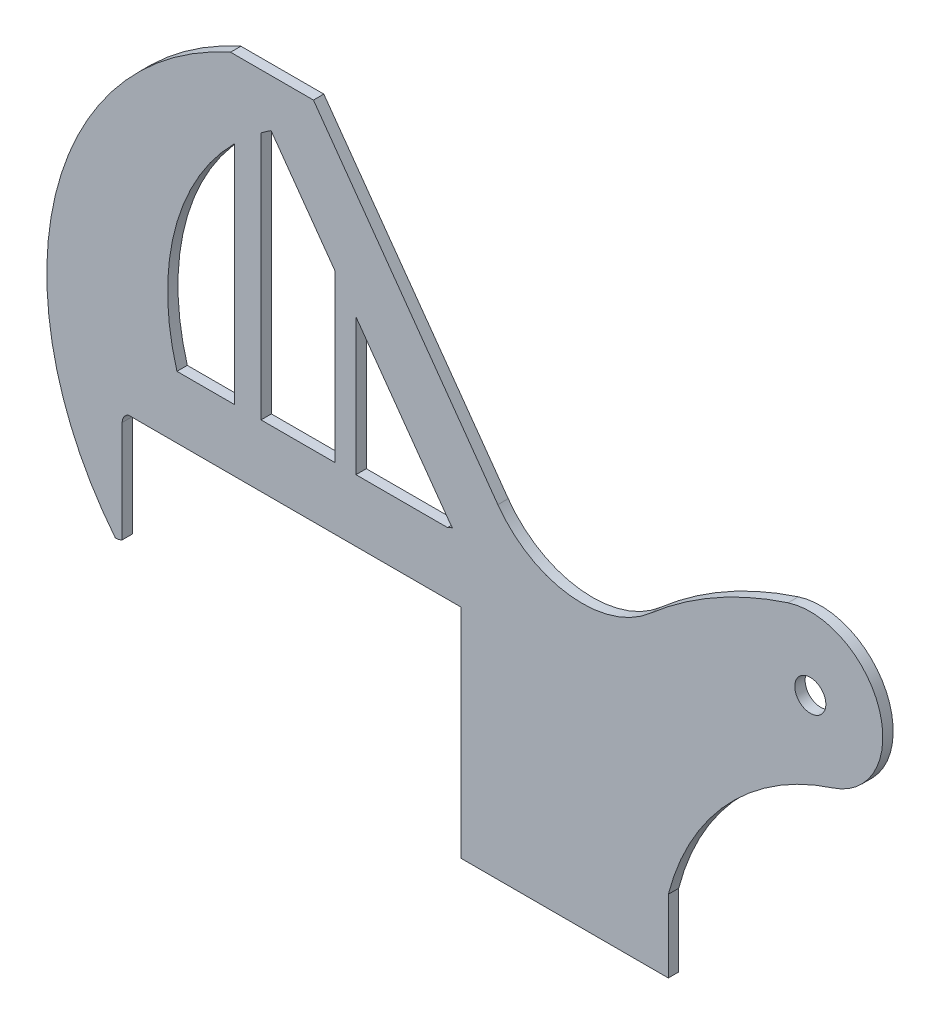
ISO-10303-21;
HEADER;
FILE_DESCRIPTION(('STEP AP214'),'2;1');
FILE_NAME('part.step','',(''),(''),'','','');
FILE_SCHEMA(('AUTOMOTIVE_DESIGN { 1 0 10303 214 1 1 1 1 }'));
ENDSEC;
DATA;
#1=APPLICATION_CONTEXT('core data for automotive mechanical design processes');
#2=APPLICATION_PROTOCOL_DEFINITION('international standard','automotive_design',2000,#1);
#3=PRODUCT_CONTEXT('',#1,'mechanical');
#4=PRODUCT('Part','Part','',(#3));
#5=PRODUCT_RELATED_PRODUCT_CATEGORY('part','',(#4));
#6=PRODUCT_DEFINITION_FORMATION('','',#4);
#7=PRODUCT_DEFINITION_CONTEXT('part definition',#1,'design');
#8=PRODUCT_DEFINITION('design','',#6,#7);
#9=PRODUCT_DEFINITION_SHAPE('','',#8);
#10=(LENGTH_UNIT() NAMED_UNIT(*) SI_UNIT(.MILLI.,.METRE.));
#11=(NAMED_UNIT(*) PLANE_ANGLE_UNIT() SI_UNIT($,.RADIAN.));
#12=(NAMED_UNIT(*) SI_UNIT($,.STERADIAN.) SOLID_ANGLE_UNIT());
#13=UNCERTAINTY_MEASURE_WITH_UNIT(LENGTH_MEASURE(1.E-05),#10,'distance_accuracy_value','');
#14=(GEOMETRIC_REPRESENTATION_CONTEXT(3) GLOBAL_UNCERTAINTY_ASSIGNED_CONTEXT((#13)) GLOBAL_UNIT_ASSIGNED_CONTEXT((#10,
#11,#12)) REPRESENTATION_CONTEXT('',''));
#15=CARTESIAN_POINT('',(0.,0.,0.));
#16=DIRECTION('',(0.,0.,1.));
#17=DIRECTION('',(1.,0.,0.));
#18=AXIS2_PLACEMENT_3D('',#15,#16,#17);
#19=CARTESIAN_POINT('',(-46.5012475591657,-2.898315985604,-5.));
#20=DIRECTION('',(0.,0.,-1.));
#21=DIRECTION('',(-1.,0.,0.));
#22=AXIS2_PLACEMENT_3D('',#19,#20,#21);
#23=PLANE('',#22);
#24=CARTESIAN_POINT('',(153.703952572074,-16.6665331952951,-5.));
#25=DIRECTION('',(0.,0.,-1.));
#26=DIRECTION('',(-1.,0.,0.));
#27=AXIS2_PLACEMENT_3D('',#24,#25,#26);
#28=CIRCLE('',#27,7.50000000000001);
#29=CARTESIAN_POINT('',(146.203952572074,-16.6665331952951,-5.));
#30=VERTEX_POINT('',#29);
#31=EDGE_CURVE('E278',#30,#30,#28,.T.);
#32=ORIENTED_EDGE('',*,*,#31,.F.);
#33=EDGE_LOOP('',(#32));
#34=FACE_BOUND('',#33,.T.);
#35=DIRECTION('',(0.,-1.,0.));
#36=VECTOR('',#35,1.);
#37=CARTESIAN_POINT('',(-124.250121532529,-2.89831598560399,-5.));
#38=LINE('',#37,#36);
#39=CARTESIAN_POINT('',(-124.250121532529,74.9162880156631,-5.));
#40=VERTEX_POINT('',#39);
#41=CARTESIAN_POINT('',(-124.250121532529,-34.0837119843369,-5.));
#42=VERTEX_POINT('',#41);
#43=EDGE_CURVE('E347',#40,#42,#38,.T.);
#44=ORIENTED_EDGE('',*,*,#43,.F.);
#45=CARTESIAN_POINT('',(-46.5012475591657,-2.898315985604,-5.));
#46=DIRECTION('',(0.,0.,-1.));
#47=DIRECTION('',(-1.,0.,0.));
#48=AXIS2_PLACEMENT_3D('',#45,#46,#47);
#49=CIRCLE('',#48,110.);
#50=CARTESIAN_POINT('',(-151.988076482981,-34.0837119843369,-5.));
#51=VERTEX_POINT('',#50);
#52=EDGE_CURVE('E356',#51,#40,#49,.T.);
#53=ORIENTED_EDGE('',*,*,#52,.F.);
#54=DIRECTION('',(-1.,0.,0.));
#55=VECTOR('',#54,1.);
#56=CARTESIAN_POINT('',(-46.5012475591657,-34.0837119843369,-5.));
#57=LINE('',#56,#55);
#58=EDGE_CURVE('E351',#42,#51,#57,.T.);
#59=ORIENTED_EDGE('',*,*,#58,.F.);
#60=EDGE_LOOP('',(#44,#53,#59));
#61=FACE_BOUND('',#60,.T.);
#62=DIRECTION('',(0.581238193719097,-0.813733471206735,0.));
#63=VECTOR('',#62,1.);
#64=CARTESIAN_POINT('',(-42.6803893935301,-0.169131581578513,-5.));
#65=LINE('',#64,#63);
#66=CARTESIAN_POINT('',(-106.558315082509,89.2599643829915,-5.));
#67=VERTEX_POINT('',#66);
#68=CARTESIAN_POINT('',(-75.5985462487027,45.9162880156631,-5.));
#69=VERTEX_POINT('',#68);
#70=EDGE_CURVE('E360',#67,#69,#65,.T.);
#71=ORIENTED_EDGE('',*,*,#70,.F.);
#72=CARTESIAN_POINT('',(-46.5012475591657,-2.898315985604,-5.));
#73=DIRECTION('',(0.,0.,-1.));
#74=DIRECTION('',(-1.,0.,0.));
#75=AXIS2_PLACEMENT_3D('',#72,#73,#74);
#76=CIRCLE('',#75,110.);
#77=CARTESIAN_POINT('',(-111.400909469673,85.9162880156631,-5.));
#78=VERTEX_POINT('',#77);
#79=EDGE_CURVE('E378',#78,#67,#76,.T.);
#80=ORIENTED_EDGE('',*,*,#79,.F.);
#81=DIRECTION('',(0.,1.,0.));
#82=VECTOR('',#81,1.);
#83=CARTESIAN_POINT('',(-111.400909469673,-2.898315985604,-5.));
#84=LINE('',#83,#82);
#85=CARTESIAN_POINT('',(-111.400909469673,-34.0837119843369,-5.));
#86=VERTEX_POINT('',#85);
#87=EDGE_CURVE('E373',#86,#78,#84,.T.);
#88=ORIENTED_EDGE('',*,*,#87,.F.);
#89=DIRECTION('',(-1.,0.,0.));
#90=VECTOR('',#89,1.);
#91=CARTESIAN_POINT('',(-46.5012475591657,-34.0837119843369,-5.));
#92=LINE('',#91,#90);
#93=CARTESIAN_POINT('',(-75.5985462487027,-34.0837119843369,-5.));
#94=VERTEX_POINT('',#93);
#95=EDGE_CURVE('E369',#94,#86,#92,.T.);
#96=ORIENTED_EDGE('',*,*,#95,.F.);
#97=DIRECTION('',(0.,1.,0.));
#98=VECTOR('',#97,1.);
#99=CARTESIAN_POINT('',(-75.5985462487027,-2.89831598560401,-5.));
#100=LINE('',#99,#98);
#101=EDGE_CURVE('E364',#94,#69,#100,.T.);
#102=ORIENTED_EDGE('',*,*,#101,.T.);
#103=EDGE_LOOP('',(#71,#80,#88,#96,#102));
#104=FACE_BOUND('',#103,.T.);
#105=DIRECTION('',(-0.908760762333003,-0.417317477280715,0.));
#106=VECTOR('',#105,1.);
#107=CARTESIAN_POINT('',(-30.2998668742654,-38.178839480558,-5.));
#108=LINE('',#107,#106);
#109=CARTESIAN_POINT('',(-19.0840716221747,-33.0283669092253,-5.));
#110=VERTEX_POINT('',#109);
#111=CARTESIAN_POINT('',(-21.3822169124991,-34.0837119843369,-5.));
#112=VERTEX_POINT('',#111);
#113=EDGE_CURVE('E385',#110,#112,#108,.T.);
#114=ORIENTED_EDGE('',*,*,#113,.F.);
#115=CARTESIAN_POINT('',(43.583392810866,16.6987776049491,-5.));
#116=DIRECTION('',(0.,0.,-1.));
#117=DIRECTION('',(-1.,0.,0.));
#118=AXIS2_PLACEMENT_3D('',#115,#116,#117);
#119=CIRCLE('',#118,80.);
#120=CARTESIAN_POINT('',(-21.5152848856728,-29.8002778925786,-5.));
#121=VERTEX_POINT('',#120);
#122=EDGE_CURVE('E367',#110,#121,#119,.T.);
#123=ORIENTED_EDGE('',*,*,#122,.T.);
#124=DIRECTION('',(0.581238193719097,-0.813733471206735,0.));
#125=VECTOR('',#124,1.);
#126=CARTESIAN_POINT('',(-42.6803893935301,-0.169131581578513,-5.));
#127=LINE('',#126,#125);
#128=CARTESIAN_POINT('',(-65.5985462487027,31.9162880156631,-5.));
#129=VERTEX_POINT('',#128);
#130=EDGE_CURVE('E395',#129,#121,#127,.T.);
#131=ORIENTED_EDGE('',*,*,#130,.F.);
#132=DIRECTION('',(0.,-1.,0.));
#133=VECTOR('',#132,1.);
#134=CARTESIAN_POINT('',(-65.5985462487027,-2.898315985604,-5.));
#135=LINE('',#134,#133);
#136=CARTESIAN_POINT('',(-65.5985462487027,-34.0837119843369,-5.));
#137=VERTEX_POINT('',#136);
#138=EDGE_CURVE('E384',#129,#137,#135,.T.);
#139=ORIENTED_EDGE('',*,*,#138,.T.);
#140=DIRECTION('',(-1.,0.,0.));
#141=VECTOR('',#140,1.);
#142=CARTESIAN_POINT('',(-46.5012475591657,-34.0837119843369,-5.));
#143=LINE('',#142,#141);
#144=EDGE_CURVE('E388',#112,#137,#143,.T.);
#145=ORIENTED_EDGE('',*,*,#144,.F.);
#146=EDGE_LOOP('',(#114,#123,#131,#139,#145));
#147=FACE_BOUND('',#146,.T.);
#148=DIRECTION('',(0.,-1.,0.));
#149=VECTOR('',#148,1.);
#150=CARTESIAN_POINT('',(-178.423236570133,0.,-5.));
#151=LINE('',#150,#149);
#152=CARTESIAN_POINT('',(-178.423236570133,-68.6662876792927,-5.));
#153=VERTEX_POINT('',#152);
#154=CARTESIAN_POINT('',(-178.423236570133,-117.76733605745,-5.));
#155=VERTEX_POINT('',#154);
#156=EDGE_CURVE('E290',#153,#155,#151,.T.);
#157=ORIENTED_EDGE('',*,*,#156,.T.);
#158=CARTESIAN_POINT('',(-181.423236570133,-112.571183634743,-5.));
#159=DIRECTION('',(0.,0.,1.));
#160=DIRECTION('',(1.,0.,0.));
#161=AXIS2_PLACEMENT_3D('',#158,#159,#160);
#162=CIRCLE('',#161,5.99999999999999);
#163=CARTESIAN_POINT('',(-181.759434047816,-118.561757167886,-5.));
#164=VERTEX_POINT('',#163);
#165=EDGE_CURVE('E73',#164,#155,#162,.T.);
#166=ORIENTED_EDGE('',*,*,#165,.F.);
#167=CARTESIAN_POINT('',(-64.8050101889918,-24.6380501506983,-5.));
#168=DIRECTION('',(0.,0.,1.));
#169=DIRECTION('',(1.,0.,0.));
#170=AXIS2_PLACEMENT_3D('',#167,#168,#169);
#171=CIRCLE('',#170,150.);
#172=CARTESIAN_POINT('',(-126.118657217934,112.258394974843,-5.));
#173=VERTEX_POINT('',#172);
#174=EDGE_CURVE('E295',#173,#164,#171,.T.);
#175=ORIENTED_EDGE('',*,*,#174,.F.);
#176=DIRECTION('',(-1.,0.,0.));
#177=VECTOR('',#176,1.);
#178=CARTESIAN_POINT('',(-46.5012475591657,112.258394974843,-5.));
#179=LINE('',#178,#177);
#180=CARTESIAN_POINT('',(-86.118657217934,112.258394974843,-5.));
#181=VERTEX_POINT('',#180);
#182=EDGE_CURVE('E441',#181,#173,#179,.T.);
#183=ORIENTED_EDGE('',*,*,#182,.F.);
#184=DIRECTION('',(-0.581238193719097,0.813733471206735,0.));
#185=VECTOR('',#184,1.);
#186=CARTESIAN_POINT('',(-97.1032807494708,127.636867918994,-5.));
#187=LINE('',#186,#185);
#188=CARTESIAN_POINT('',(2.89671925052924,-12.3631320810057,-5.));
#189=VERTEX_POINT('',#188);
#190=EDGE_CURVE('E334',#189,#181,#187,.T.);
#191=ORIENTED_EDGE('',*,*,#190,.F.);
#192=CARTESIAN_POINT('',(43.583392810866,16.6987776049491,-5.));
#193=DIRECTION('',(0.,0.,-1.));
#194=DIRECTION('',(1.,0.,0.));
#195=AXIS2_PLACEMENT_3D('',#192,#193,#194);
#196=CIRCLE('',#195,50.);
#197=CARTESIAN_POINT('',(76.4505432255038,-20.9807980776614,-5.));
#198=VERTEX_POINT('',#197);
#199=EDGE_CURVE('E312',#198,#189,#196,.T.);
#200=ORIENTED_EDGE('',*,*,#199,.F.);
#201=CARTESIAN_POINT('',(201.345714801128,-164.163185671581,-5.));
#202=DIRECTION('',(0.,0.,1.));
#203=DIRECTION('',(-1.,0.,0.));
#204=AXIS2_PLACEMENT_3D('',#201,#202,#203);
#205=CIRCLE('',#204,190.);
#206=CARTESIAN_POINT('',(142.946135294546,16.6391625251566,-5.));
#207=VERTEX_POINT('',#206);
#208=EDGE_CURVE('E309',#207,#198,#205,.T.);
#209=ORIENTED_EDGE('',*,*,#208,.F.);
#210=CARTESIAN_POINT('',(153.703952572074,-16.6665331952951,-5.));
#211=DIRECTION('',(0.,0.,1.));
#212=DIRECTION('',(1.,0.,0.));
#213=AXIS2_PLACEMENT_3D('',#210,#211,#212);
#214=CIRCLE('',#213,35.);
#215=CARTESIAN_POINT('',(164.461769849602,-49.9722289157468,-5.));
#216=VERTEX_POINT('',#215);
#217=EDGE_CURVE('E306',#216,#207,#214,.T.);
#218=ORIENTED_EDGE('',*,*,#217,.F.);
#219=CARTESIAN_POINT('',(201.345714801128,-164.163185671581,-5.));
#220=DIRECTION('',(0.,0.,-1.));
#221=DIRECTION('',(-1.,0.,0.));
#222=AXIS2_PLACEMENT_3D('',#219,#220,#221);
#223=CIRCLE('',#222,120.);
#224=CARTESIAN_POINT('',(85.1767634298667,-134.083711984337,-5.));
#225=VERTEX_POINT('',#224);
#226=EDGE_CURVE('E303',#225,#216,#223,.T.);
#227=ORIENTED_EDGE('',*,*,#226,.F.);
#228=DIRECTION('',(0.,1.,0.));
#229=VECTOR('',#228,1.);
#230=CARTESIAN_POINT('',(85.1767634298667,-134.083711984337,-5.));
#231=LINE('',#230,#229);
#232=CARTESIAN_POINT('',(85.1767634298667,-169.083711984337,-5.));
#233=VERTEX_POINT('',#232);
#234=EDGE_CURVE('E266',#233,#225,#231,.T.);
#235=ORIENTED_EDGE('',*,*,#234,.F.);
#236=DIRECTION('',(1.,0.,0.));
#237=VECTOR('',#236,1.);
#238=CARTESIAN_POINT('',(-14.8232365701333,-169.083711984337,-5.));
#239=LINE('',#238,#237);
#240=CARTESIAN_POINT('',(-14.8232365701333,-169.083711984337,-5.));
#241=VERTEX_POINT('',#240);
#242=EDGE_CURVE('E262',#241,#233,#239,.T.);
#243=ORIENTED_EDGE('',*,*,#242,.F.);
#244=DIRECTION('',(0.,-1.,0.));
#245=VECTOR('',#244,1.);
#246=CARTESIAN_POINT('',(-14.8232365701333,-64.0837119843369,-5.));
#247=LINE('',#246,#245);
#248=CARTESIAN_POINT('',(-14.8232365701333,-64.0837119843369,-5.));
#249=VERTEX_POINT('',#248);
#250=EDGE_CURVE('E245',#249,#241,#247,.T.);
#251=ORIENTED_EDGE('',*,*,#250,.F.);
#252=DIRECTION('',(1.,0.,0.));
#253=VECTOR('',#252,1.);
#254=CARTESIAN_POINT('',(-172.423236570133,-64.0837119843369,-5.));
#255=LINE('',#254,#253);
#256=CARTESIAN_POINT('',(-175.423236570133,-64.0837119843369,-5.));
#257=VERTEX_POINT('',#256);
#258=EDGE_CURVE('E256',#257,#249,#255,.T.);
#259=ORIENTED_EDGE('',*,*,#258,.F.);
#260=CARTESIAN_POINT('',(-173.423236570133,-68.6662876792927,-5.));
#261=DIRECTION('',(0.,0.,1.));
#262=DIRECTION('',(1.,0.,0.));
#263=AXIS2_PLACEMENT_3D('',#260,#261,#262);
#264=CIRCLE('',#263,5.);
#265=EDGE_CURVE('E368',#257,#153,#264,.T.);
#266=ORIENTED_EDGE('',*,*,#265,.T.);
#267=EDGE_LOOP('',(#157,#166,#175,#183,#191,#200,#209,#218,#227,#235,#243,#251,#259,#266));
#268=FACE_BOUND('',#267,.T.);
#269=ADVANCED_FACE('F57',(#34,#61,#104,#147,#268),#23,.T.);
#270=CARTESIAN_POINT('',(-46.5012475591657,-2.898315985604,0.));
#271=DIRECTION('',(0.,0.,-1.));
#272=DIRECTION('',(-1.,0.,0.));
#273=AXIS2_PLACEMENT_3D('',#270,#271,#272);
#274=PLANE('',#273);
#275=CARTESIAN_POINT('',(153.703952572074,-16.6665331952951,0.));
#276=DIRECTION('',(0.,0.,1.));
#277=DIRECTION('',(1.,0.,0.));
#278=AXIS2_PLACEMENT_3D('',#275,#276,#277);
#279=CIRCLE('',#278,7.50000000000001);
#280=CARTESIAN_POINT('',(161.203952572074,-16.6665331952951,0.));
#281=VERTEX_POINT('',#280);
#282=EDGE_CURVE('E859',#281,#281,#279,.T.);
#283=ORIENTED_EDGE('',*,*,#282,.F.);
#284=EDGE_LOOP('',(#283));
#285=FACE_BOUND('',#284,.T.);
#286=CARTESIAN_POINT('',(43.583392810866,16.6987776049491,0.));
#287=DIRECTION('',(0.,0.,1.));
#288=DIRECTION('',(1.,0.,0.));
#289=AXIS2_PLACEMENT_3D('',#286,#287,#288);
#290=CIRCLE('',#289,80.);
#291=CARTESIAN_POINT('',(-21.5152848856728,-29.8002778925786,0.));
#292=VERTEX_POINT('',#291);
#293=CARTESIAN_POINT('',(-19.0840716221747,-33.0283669092253,0.));
#294=VERTEX_POINT('',#293);
#295=EDGE_CURVE('E316',#292,#294,#290,.T.);
#296=ORIENTED_EDGE('',*,*,#295,.T.);
#297=DIRECTION('',(0.908760762333003,0.417317477280715,0.));
#298=VECTOR('',#297,1.);
#299=CARTESIAN_POINT('',(9.20217056731396,-20.038872070161,0.));
#300=LINE('',#299,#298);
#301=CARTESIAN_POINT('',(-21.3822169124991,-34.0837119843369,0.));
#302=VERTEX_POINT('',#301);
#303=EDGE_CURVE('E391',#302,#294,#300,.T.);
#304=ORIENTED_EDGE('',*,*,#303,.F.);
#305=DIRECTION('',(1.,0.,0.));
#306=VECTOR('',#305,1.);
#307=CARTESIAN_POINT('',(0.,-34.0837119843369,0.));
#308=LINE('',#307,#306);
#309=CARTESIAN_POINT('',(-65.5985462487027,-34.0837119843369,0.));
#310=VERTEX_POINT('',#309);
#311=EDGE_CURVE('E402',#310,#302,#308,.T.);
#312=ORIENTED_EDGE('',*,*,#311,.F.);
#313=DIRECTION('',(0.,1.,0.));
#314=VECTOR('',#313,1.);
#315=CARTESIAN_POINT('',(-65.5985462487027,0.,0.));
#316=LINE('',#315,#314);
#317=CARTESIAN_POINT('',(-65.5985462487027,31.9162880156631,0.));
#318=VERTEX_POINT('',#317);
#319=EDGE_CURVE('E337',#310,#318,#316,.T.);
#320=ORIENTED_EDGE('',*,*,#319,.T.);
#321=DIRECTION('',(-0.581238193719097,0.813733471206735,0.));
#322=VECTOR('',#321,1.);
#323=CARTESIAN_POINT('',(-28.3413335897057,-20.2438097069326,0.));
#324=LINE('',#323,#322);
#325=EDGE_CURVE('E363',#292,#318,#324,.T.);
#326=ORIENTED_EDGE('',*,*,#325,.F.);
#327=EDGE_LOOP('',(#296,#304,#312,#320,#326));
#328=FACE_BOUND('',#327,.T.);
#329=CARTESIAN_POINT('',(-46.5012475591657,-2.898315985604,0.));
#330=DIRECTION('',(0.,0.,1.));
#331=DIRECTION('',(1.,0.,0.));
#332=AXIS2_PLACEMENT_3D('',#329,#330,#331);
#333=CIRCLE('',#332,110.);
#334=CARTESIAN_POINT('',(-106.558315082509,89.2599643829914,0.));
#335=VERTEX_POINT('',#334);
#336=CARTESIAN_POINT('',(-111.400909469673,85.9162880156631,0.));
#337=VERTEX_POINT('',#336);
#338=EDGE_CURVE('E350',#335,#337,#333,.T.);
#339=ORIENTED_EDGE('',*,*,#338,.F.);
#340=DIRECTION('',(-0.581238193719097,0.813733471206735,0.));
#341=VECTOR('',#340,1.);
#342=CARTESIAN_POINT('',(-28.3413335897057,-20.2438097069326,0.));
#343=LINE('',#342,#341);
#344=CARTESIAN_POINT('',(-75.5985462487027,45.9162880156631,0.));
#345=VERTEX_POINT('',#344);
#346=EDGE_CURVE('E421',#345,#335,#343,.T.);
#347=ORIENTED_EDGE('',*,*,#346,.F.);
#348=DIRECTION('',(0.,-1.,0.));
#349=VECTOR('',#348,1.);
#350=CARTESIAN_POINT('',(-75.5985462487027,0.,0.));
#351=LINE('',#350,#349);
#352=CARTESIAN_POINT('',(-75.5985462487027,-34.0837119843369,0.));
#353=VERTEX_POINT('',#352);
#354=EDGE_CURVE('E394',#345,#353,#351,.T.);
#355=ORIENTED_EDGE('',*,*,#354,.T.);
#356=DIRECTION('',(1.,0.,0.));
#357=VECTOR('',#356,1.);
#358=CARTESIAN_POINT('',(0.,-34.0837119843369,0.));
#359=LINE('',#358,#357);
#360=CARTESIAN_POINT('',(-111.400909469673,-34.0837119843369,0.));
#361=VERTEX_POINT('',#360);
#362=EDGE_CURVE('E377',#361,#353,#359,.T.);
#363=ORIENTED_EDGE('',*,*,#362,.F.);
#364=DIRECTION('',(0.,-1.,0.));
#365=VECTOR('',#364,1.);
#366=CARTESIAN_POINT('',(-111.400909469673,0.,0.));
#367=LINE('',#366,#365);
#368=EDGE_CURVE('E381',#337,#361,#367,.T.);
#369=ORIENTED_EDGE('',*,*,#368,.F.);
#370=EDGE_LOOP('',(#339,#347,#355,#363,#369));
#371=FACE_BOUND('',#370,.T.);
#372=CARTESIAN_POINT('',(-46.5012475591657,-2.898315985604,0.));
#373=DIRECTION('',(0.,0.,1.));
#374=DIRECTION('',(1.,0.,0.));
#375=AXIS2_PLACEMENT_3D('',#372,#373,#374);
#376=CIRCLE('',#375,110.);
#377=CARTESIAN_POINT('',(-124.250121532529,74.9162880156631,0.));
#378=VERTEX_POINT('',#377);
#379=CARTESIAN_POINT('',(-151.988076482981,-34.0837119843369,0.));
#380=VERTEX_POINT('',#379);
#381=EDGE_CURVE('E434',#378,#380,#376,.T.);
#382=ORIENTED_EDGE('',*,*,#381,.F.);
#383=DIRECTION('',(0.,1.,0.));
#384=VECTOR('',#383,1.);
#385=CARTESIAN_POINT('',(-124.250121532529,0.,0.));
#386=LINE('',#385,#384);
#387=CARTESIAN_POINT('',(-124.250121532529,-34.0837119843369,0.));
#388=VERTEX_POINT('',#387);
#389=EDGE_CURVE('E355',#388,#378,#386,.T.);
#390=ORIENTED_EDGE('',*,*,#389,.F.);
#391=DIRECTION('',(1.,0.,0.));
#392=VECTOR('',#391,1.);
#393=CARTESIAN_POINT('',(0.,-34.0837119843369,0.));
#394=LINE('',#393,#392);
#395=EDGE_CURVE('E359',#380,#388,#394,.T.);
#396=ORIENTED_EDGE('',*,*,#395,.F.);
#397=EDGE_LOOP('',(#382,#390,#396));
#398=FACE_BOUND('',#397,.T.);
#399=CARTESIAN_POINT('',(-181.423236570133,-112.571183634743,0.));
#400=DIRECTION('',(0.,0.,1.));
#401=DIRECTION('',(1.,0.,0.));
#402=AXIS2_PLACEMENT_3D('',#399,#400,#401);
#403=CIRCLE('',#402,5.99999999999999);
#404=CARTESIAN_POINT('',(-181.759434047816,-118.561757167886,0.));
#405=VERTEX_POINT('',#404);
#406=CARTESIAN_POINT('',(-178.423236570133,-117.76733605745,0.));
#407=VERTEX_POINT('',#406);
#408=EDGE_CURVE('E282',#405,#407,#403,.T.);
#409=ORIENTED_EDGE('',*,*,#408,.T.);
#410=DIRECTION('',(0.,-1.,0.));
#411=VECTOR('',#410,1.);
#412=CARTESIAN_POINT('',(-178.423236570133,0.,0.));
#413=LINE('',#412,#411);
#414=CARTESIAN_POINT('',(-178.423236570133,-68.6662876792927,0.));
#415=VERTEX_POINT('',#414);
#416=EDGE_CURVE('E448',#415,#407,#413,.T.);
#417=ORIENTED_EDGE('',*,*,#416,.F.);
#418=CARTESIAN_POINT('',(-173.423236570133,-68.6662876792927,0.));
#419=DIRECTION('',(0.,0.,1.));
#420=DIRECTION('',(1.,0.,0.));
#421=AXIS2_PLACEMENT_3D('',#418,#419,#420);
#422=CIRCLE('',#421,5.);
#423=CARTESIAN_POINT('',(-175.423236570133,-64.0837119843369,0.));
#424=VERTEX_POINT('',#423);
#425=EDGE_CURVE('E65',#424,#415,#422,.T.);
#426=ORIENTED_EDGE('',*,*,#425,.F.);
#427=DIRECTION('',(1.,0.,0.));
#428=VECTOR('',#427,1.);
#429=CARTESIAN_POINT('',(-172.423236570133,-64.0837119843369,0.));
#430=LINE('',#429,#428);
#431=CARTESIAN_POINT('',(-14.8232365701333,-64.0837119843369,0.));
#432=VERTEX_POINT('',#431);
#433=EDGE_CURVE('E331',#424,#432,#430,.T.);
#434=ORIENTED_EDGE('',*,*,#433,.T.);
#435=DIRECTION('',(0.,-1.,0.));
#436=VECTOR('',#435,1.);
#437=CARTESIAN_POINT('',(-14.8232365701333,-64.0837119843369,0.));
#438=LINE('',#437,#436);
#439=CARTESIAN_POINT('',(-14.8232365701333,-169.083711984337,0.));
#440=VERTEX_POINT('',#439);
#441=EDGE_CURVE('E329',#432,#440,#438,.T.);
#442=ORIENTED_EDGE('',*,*,#441,.T.);
#443=DIRECTION('',(1.,0.,0.));
#444=VECTOR('',#443,1.);
#445=CARTESIAN_POINT('',(-14.8232365701333,-169.083711984337,0.));
#446=LINE('',#445,#444);
#447=CARTESIAN_POINT('',(85.1767634298667,-169.083711984337,0.));
#448=VERTEX_POINT('',#447);
#449=EDGE_CURVE('E264',#440,#448,#446,.T.);
#450=ORIENTED_EDGE('',*,*,#449,.T.);
#451=DIRECTION('',(0.,1.,0.));
#452=VECTOR('',#451,1.);
#453=CARTESIAN_POINT('',(85.1767634298667,-134.083711984337,0.));
#454=LINE('',#453,#452);
#455=CARTESIAN_POINT('',(85.1767634298667,-134.083711984337,0.));
#456=VERTEX_POINT('',#455);
#457=EDGE_CURVE('E272',#448,#456,#454,.T.);
#458=ORIENTED_EDGE('',*,*,#457,.T.);
#459=CARTESIAN_POINT('',(201.345714801128,-164.163185671581,0.));
#460=DIRECTION('',(0.,0.,-1.));
#461=DIRECTION('',(-1.,0.,0.));
#462=AXIS2_PLACEMENT_3D('',#459,#460,#461);
#463=CIRCLE('',#462,120.);
#464=CARTESIAN_POINT('',(164.461769849602,-49.9722289157468,0.));
#465=VERTEX_POINT('',#464);
#466=EDGE_CURVE('E326',#456,#465,#463,.T.);
#467=ORIENTED_EDGE('',*,*,#466,.T.);
#468=CARTESIAN_POINT('',(153.703952572074,-16.6665331952951,0.));
#469=DIRECTION('',(0.,0.,1.));
#470=DIRECTION('',(1.,0.,0.));
#471=AXIS2_PLACEMENT_3D('',#468,#469,#470);
#472=CIRCLE('',#471,35.);
#473=CARTESIAN_POINT('',(142.946135294546,16.6391625251566,0.));
#474=VERTEX_POINT('',#473);
#475=EDGE_CURVE('E323',#465,#474,#472,.T.);
#476=ORIENTED_EDGE('',*,*,#475,.T.);
#477=CARTESIAN_POINT('',(201.345714801128,-164.163185671581,0.));
#478=DIRECTION('',(0.,0.,1.));
#479=DIRECTION('',(-1.,0.,0.));
#480=AXIS2_PLACEMENT_3D('',#477,#478,#479);
#481=CIRCLE('',#480,190.);
#482=CARTESIAN_POINT('',(76.4505432255038,-20.9807980776614,0.));
#483=VERTEX_POINT('',#482);
#484=EDGE_CURVE('E320',#474,#483,#481,.T.);
#485=ORIENTED_EDGE('',*,*,#484,.T.);
#486=CARTESIAN_POINT('',(43.583392810866,16.6987776049491,0.));
#487=DIRECTION('',(0.,0.,-1.));
#488=DIRECTION('',(1.,0.,0.));
#489=AXIS2_PLACEMENT_3D('',#486,#487,#488);
#490=CIRCLE('',#489,50.);
#491=CARTESIAN_POINT('',(2.89671925052924,-12.3631320810057,0.));
#492=VERTEX_POINT('',#491);
#493=EDGE_CURVE('E317',#483,#492,#490,.T.);
#494=ORIENTED_EDGE('',*,*,#493,.T.);
#495=DIRECTION('',(-0.581238193719097,0.813733471206735,0.));
#496=VECTOR('',#495,1.);
#497=CARTESIAN_POINT('',(-97.1032807494708,127.636867918994,0.));
#498=LINE('',#497,#496);
#499=CARTESIAN_POINT('',(-86.118657217934,112.258394974843,0.));
#500=VERTEX_POINT('',#499);
#501=EDGE_CURVE('E313',#492,#500,#498,.T.);
#502=ORIENTED_EDGE('',*,*,#501,.T.);
#503=DIRECTION('',(1.,0.,0.));
#504=VECTOR('',#503,1.);
#505=CARTESIAN_POINT('',(0.,112.258394974843,0.));
#506=LINE('',#505,#504);
#507=CARTESIAN_POINT('',(-126.118657217934,112.258394974843,0.));
#508=VERTEX_POINT('',#507);
#509=EDGE_CURVE('E296',#508,#500,#506,.T.);
#510=ORIENTED_EDGE('',*,*,#509,.F.);
#511=CARTESIAN_POINT('',(-64.8050101889918,-24.6380501506983,0.));
#512=DIRECTION('',(0.,0.,1.));
#513=DIRECTION('',(1.,0.,0.));
#514=AXIS2_PLACEMENT_3D('',#511,#512,#513);
#515=CIRCLE('',#514,150.);
#516=EDGE_CURVE('E60',#508,#405,#515,.T.);
#517=ORIENTED_EDGE('',*,*,#516,.T.);
#518=EDGE_LOOP('',(#409,#417,#426,#434,#442,#450,#458,#467,#476,#485,#494,#502,#510,#517));
#519=FACE_BOUND('',#518,.T.);
#520=ADVANCED_FACE('F465',(#285,#328,#371,#398,#519),#274,.F.);
#521=CARTESIAN_POINT('',(-64.8050101889918,-24.6380501506983,-5.));
#522=DIRECTION('',(0.,0.,1.));
#523=DIRECTION('',(1.,0.,0.));
#524=AXIS2_PLACEMENT_3D('',#521,#522,#523);
#525=CYLINDRICAL_SURFACE('',#524,150.);
#526=ORIENTED_EDGE('',*,*,#174,.T.);
#527=DIRECTION('',(0.,0.,1.));
#528=VECTOR('',#527,1.);
#529=CARTESIAN_POINT('',(-181.759434047816,-118.561757167886,-5.));
#530=LINE('',#529,#528);
#531=EDGE_CURVE('E285',#164,#405,#530,.T.);
#532=ORIENTED_EDGE('',*,*,#531,.T.);
#533=ORIENTED_EDGE('',*,*,#516,.F.);
#534=DIRECTION('',(0.,0.,1.));
#535=VECTOR('',#534,1.);
#536=CARTESIAN_POINT('',(-126.118657217934,112.258394974843,-10.));
#537=LINE('',#536,#535);
#538=EDGE_CURVE('E100',#173,#508,#537,.T.);
#539=ORIENTED_EDGE('',*,*,#538,.F.);
#540=EDGE_LOOP('',(#526,#532,#533,#539));
#541=FACE_BOUND('',#540,.T.);
#542=ADVANCED_FACE('F453',(#541),#525,.T.);
#543=CARTESIAN_POINT('',(-178.423236570133,0.,-5.));
#544=DIRECTION('',(-1.,0.,0.));
#545=DIRECTION('',(0.,0.,1.));
#546=AXIS2_PLACEMENT_3D('',#543,#544,#545);
#547=PLANE('',#546);
#548=DIRECTION('',(0.,0.,1.));
#549=VECTOR('',#548,1.);
#550=CARTESIAN_POINT('',(-178.423236570133,-117.76733605745,-5.));
#551=LINE('',#550,#549);
#552=EDGE_CURVE('E288',#155,#407,#551,.T.);
#553=ORIENTED_EDGE('',*,*,#552,.F.);
#554=ORIENTED_EDGE('',*,*,#156,.F.);
#555=DIRECTION('',(0.,0.,1.));
#556=VECTOR('',#555,1.);
#557=CARTESIAN_POINT('',(-178.423236570133,-68.6662876792927,-5.));
#558=LINE('',#557,#556);
#559=EDGE_CURVE('E89',#153,#415,#558,.T.);
#560=ORIENTED_EDGE('',*,*,#559,.T.);
#561=ORIENTED_EDGE('',*,*,#416,.T.);
#562=EDGE_LOOP('',(#553,#554,#560,#561));
#563=FACE_BOUND('',#562,.T.);
#564=ADVANCED_FACE('F615',(#563),#547,.F.);
#565=CARTESIAN_POINT('',(-97.1032807494708,127.636867918994,-5.));
#566=DIRECTION('',(0.813733471206735,0.581238193719097,0.));
#567=DIRECTION('',(-0.581238193719097,0.813733471206735,0.));
#568=AXIS2_PLACEMENT_3D('',#565,#566,#567);
#569=PLANE('',#568);
#570=DIRECTION('',(0.,0.,-1.));
#571=VECTOR('',#570,1.);
#572=CARTESIAN_POINT('',(-86.118657217934,112.258394974843,-5.));
#573=LINE('',#572,#571);
#574=EDGE_CURVE('E293',#500,#181,#573,.T.);
#575=ORIENTED_EDGE('',*,*,#574,.F.);
#576=ORIENTED_EDGE('',*,*,#501,.F.);
#577=DIRECTION('',(0.,0.,1.));
#578=VECTOR('',#577,1.);
#579=CARTESIAN_POINT('',(2.89671925052924,-12.3631320810057,-5.));
#580=LINE('',#579,#578);
#581=EDGE_CURVE('E310',#189,#492,#580,.T.);
#582=ORIENTED_EDGE('',*,*,#581,.F.);
#583=ORIENTED_EDGE('',*,*,#190,.T.);
#584=EDGE_LOOP('',(#575,#576,#582,#583));
#585=FACE_BOUND('',#584,.T.);
#586=ADVANCED_FACE('F463',(#585),#569,.T.);
#587=CARTESIAN_POINT('',(43.583392810866,16.6987776049491,-5.));
#588=DIRECTION('',(0.,0.,1.));
#589=DIRECTION('',(1.,0.,0.));
#590=AXIS2_PLACEMENT_3D('',#587,#588,#589);
#591=CYLINDRICAL_SURFACE('',#590,50.);
#592=ORIENTED_EDGE('',*,*,#493,.F.);
#593=DIRECTION('',(0.,0.,1.));
#594=VECTOR('',#593,1.);
#595=CARTESIAN_POINT('',(76.4505432255038,-20.9807980776614,-5.));
#596=LINE('',#595,#594);
#597=EDGE_CURVE('E307',#198,#483,#596,.T.);
#598=ORIENTED_EDGE('',*,*,#597,.F.);
#599=ORIENTED_EDGE('',*,*,#199,.T.);
#600=ORIENTED_EDGE('',*,*,#581,.T.);
#601=EDGE_LOOP('',(#592,#598,#599,#600));
#602=FACE_BOUND('',#601,.T.);
#603=ADVANCED_FACE('F469',(#602),#591,.F.);
#604=CARTESIAN_POINT('',(201.345714801128,-164.163185671581,-5.));
#605=DIRECTION('',(0.,0.,1.));
#606=DIRECTION('',(1.,0.,0.));
#607=AXIS2_PLACEMENT_3D('',#604,#605,#606);
#608=CYLINDRICAL_SURFACE('',#607,190.);
#609=ORIENTED_EDGE('',*,*,#484,.F.);
#610=DIRECTION('',(0.,0.,1.));
#611=VECTOR('',#610,1.);
#612=CARTESIAN_POINT('',(142.946135294546,16.6391625251566,-5.));
#613=LINE('',#612,#611);
#614=EDGE_CURVE('E304',#207,#474,#613,.T.);
#615=ORIENTED_EDGE('',*,*,#614,.F.);
#616=ORIENTED_EDGE('',*,*,#208,.T.);
#617=ORIENTED_EDGE('',*,*,#597,.T.);
#618=EDGE_LOOP('',(#609,#615,#616,#617));
#619=FACE_BOUND('',#618,.T.);
#620=ADVANCED_FACE('F474',(#619),#608,.T.);
#621=CARTESIAN_POINT('',(153.703952572074,-16.6665331952951,-5.));
#622=DIRECTION('',(0.,0.,1.));
#623=DIRECTION('',(1.,0.,0.));
#624=AXIS2_PLACEMENT_3D('',#621,#622,#623);
#625=CYLINDRICAL_SURFACE('',#624,35.);
#626=ORIENTED_EDGE('',*,*,#475,.F.);
#627=DIRECTION('',(0.,0.,1.));
#628=VECTOR('',#627,1.);
#629=CARTESIAN_POINT('',(164.461769849602,-49.9722289157468,-5.));
#630=LINE('',#629,#628);
#631=EDGE_CURVE('E301',#216,#465,#630,.T.);
#632=ORIENTED_EDGE('',*,*,#631,.F.);
#633=ORIENTED_EDGE('',*,*,#217,.T.);
#634=ORIENTED_EDGE('',*,*,#614,.T.);
#635=EDGE_LOOP('',(#626,#632,#633,#634));
#636=FACE_BOUND('',#635,.T.);
#637=ADVANCED_FACE('F477',(#636),#625,.T.);
#638=CARTESIAN_POINT('',(201.345714801128,-164.163185671581,-5.));
#639=DIRECTION('',(0.,0.,1.));
#640=DIRECTION('',(1.,0.,0.));
#641=AXIS2_PLACEMENT_3D('',#638,#639,#640);
#642=CYLINDRICAL_SURFACE('',#641,120.);
#643=ORIENTED_EDGE('',*,*,#466,.F.);
#644=DIRECTION('',(0.,0.,1.));
#645=VECTOR('',#644,1.);
#646=CARTESIAN_POINT('',(85.1767634298667,-134.083711984337,-5.));
#647=LINE('',#646,#645);
#648=EDGE_CURVE('E257',#225,#456,#647,.T.);
#649=ORIENTED_EDGE('',*,*,#648,.F.);
#650=ORIENTED_EDGE('',*,*,#226,.T.);
#651=ORIENTED_EDGE('',*,*,#631,.T.);
#652=EDGE_LOOP('',(#643,#649,#650,#651));
#653=FACE_BOUND('',#652,.T.);
#654=ADVANCED_FACE('F479',(#653),#642,.F.);
#655=CARTESIAN_POINT('',(-14.8232365701333,-64.0837119843369,-5.));
#656=DIRECTION('',(-1.,0.,0.));
#657=DIRECTION('',(0.,-1.,0.));
#658=AXIS2_PLACEMENT_3D('',#655,#656,#657);
#659=PLANE('',#658);
#660=ORIENTED_EDGE('',*,*,#441,.F.);
#661=DIRECTION('',(0.,0.,1.));
#662=VECTOR('',#661,1.);
#663=CARTESIAN_POINT('',(-14.8232365701333,-64.0837119843369,-5.));
#664=LINE('',#663,#662);
#665=EDGE_CURVE('E251',#249,#432,#664,.T.);
#666=ORIENTED_EDGE('',*,*,#665,.F.);
#667=ORIENTED_EDGE('',*,*,#250,.T.);
#668=DIRECTION('',(0.,0.,1.));
#669=VECTOR('',#668,1.);
#670=CARTESIAN_POINT('',(-14.8232365701333,-169.083711984337,-5.));
#671=LINE('',#670,#669);
#672=EDGE_CURVE('E249',#241,#440,#671,.T.);
#673=ORIENTED_EDGE('',*,*,#672,.T.);
#674=EDGE_LOOP('',(#660,#666,#667,#673));
#675=FACE_BOUND('',#674,.T.);
#676=ADVANCED_FACE('F248',(#675),#659,.T.);
#677=CARTESIAN_POINT('',(-172.423236570133,-64.0837119843369,-5.));
#678=DIRECTION('',(0.,-1.,0.));
#679=DIRECTION('',(0.,0.,-1.));
#680=AXIS2_PLACEMENT_3D('',#677,#678,#679);
#681=PLANE('',#680);
#682=ORIENTED_EDGE('',*,*,#433,.F.);
#683=DIRECTION('',(0.,0.,1.));
#684=VECTOR('',#683,1.);
#685=CARTESIAN_POINT('',(-175.423236570133,-64.0837119843369,-5.));
#686=LINE('',#685,#684);
#687=EDGE_CURVE('E12',#257,#424,#686,.T.);
#688=ORIENTED_EDGE('',*,*,#687,.F.);
#689=ORIENTED_EDGE('',*,*,#258,.T.);
#690=ORIENTED_EDGE('',*,*,#665,.T.);
#691=EDGE_LOOP('',(#682,#688,#689,#690));
#692=FACE_BOUND('',#691,.T.);
#693=ADVANCED_FACE('F486',(#692),#681,.T.);
#694=CARTESIAN_POINT('',(43.583392810866,16.6987776049491,-10.));
#695=DIRECTION('',(0.,0.,1.));
#696=DIRECTION('',(1.,0.,0.));
#697=AXIS2_PLACEMENT_3D('',#694,#695,#696);
#698=CYLINDRICAL_SURFACE('',#697,80.);
#699=DIRECTION('',(0.,0.,1.));
#700=VECTOR('',#699,1.);
#701=CARTESIAN_POINT('',(-19.0840716221747,-33.0283669092253,-10.));
#702=LINE('',#701,#700);
#703=EDGE_CURVE('E298',#110,#294,#702,.T.);
#704=ORIENTED_EDGE('',*,*,#703,.T.);
#705=ORIENTED_EDGE('',*,*,#295,.F.);
#706=DIRECTION('',(0.,0.,1.));
#707=VECTOR('',#706,1.);
#708=CARTESIAN_POINT('',(-21.5152848856728,-29.8002778925786,-10.));
#709=LINE('',#708,#707);
#710=EDGE_CURVE('E397',#121,#292,#709,.T.);
#711=ORIENTED_EDGE('',*,*,#710,.F.);
#712=ORIENTED_EDGE('',*,*,#122,.F.);
#713=EDGE_LOOP('',(#704,#705,#711,#712));
#714=FACE_BOUND('',#713,.T.);
#715=ADVANCED_FACE('F535',(#714),#698,.T.);
#716=CARTESIAN_POINT('',(9.20217056731396,-20.038872070161,-10.));
#717=DIRECTION('',(0.417317477280715,-0.908760762333003,0.));
#718=DIRECTION('',(0.908760762333003,0.417317477280715,0.));
#719=AXIS2_PLACEMENT_3D('',#716,#717,#718);
#720=PLANE('',#719);
#721=ORIENTED_EDGE('',*,*,#113,.T.);
#722=DIRECTION('',(0.,0.,1.));
#723=VECTOR('',#722,1.);
#724=CARTESIAN_POINT('',(-21.3822169124991,-34.0837119843369,-10.));
#725=LINE('',#724,#723);
#726=EDGE_CURVE('E387',#112,#302,#725,.T.);
#727=ORIENTED_EDGE('',*,*,#726,.T.);
#728=ORIENTED_EDGE('',*,*,#303,.T.);
#729=ORIENTED_EDGE('',*,*,#703,.F.);
#730=EDGE_LOOP('',(#721,#727,#728,#729));
#731=FACE_BOUND('',#730,.T.);
#732=ADVANCED_FACE('F523',(#731),#720,.F.);
#733=CARTESIAN_POINT('',(0.,-34.0837119843369,-10.));
#734=DIRECTION('',(0.,-1.,0.));
#735=DIRECTION('',(0.,0.,-1.));
#736=AXIS2_PLACEMENT_3D('',#733,#734,#735);
#737=PLANE('',#736);
#738=ORIENTED_EDGE('',*,*,#144,.T.);
#739=DIRECTION('',(0.,0.,1.));
#740=VECTOR('',#739,1.);
#741=CARTESIAN_POINT('',(-65.5985462487027,-34.0837119843369,-10.));
#742=LINE('',#741,#740);
#743=EDGE_CURVE('E390',#137,#310,#742,.T.);
#744=ORIENTED_EDGE('',*,*,#743,.T.);
#745=ORIENTED_EDGE('',*,*,#311,.T.);
#746=ORIENTED_EDGE('',*,*,#726,.F.);
#747=EDGE_LOOP('',(#738,#744,#745,#746));
#748=FACE_BOUND('',#747,.T.);
#749=ADVANCED_FACE('F525',(#748),#737,.F.);
#750=CARTESIAN_POINT('',(-65.5985462487027,0.,-10.));
#751=DIRECTION('',(1.,0.,0.));
#752=DIRECTION('',(0.,0.,-1.));
#753=AXIS2_PLACEMENT_3D('',#750,#751,#752);
#754=PLANE('',#753);
#755=DIRECTION('',(0.,0.,1.));
#756=VECTOR('',#755,1.);
#757=CARTESIAN_POINT('',(-65.5985462487027,31.9162880156631,-10.));
#758=LINE('',#757,#756);
#759=EDGE_CURVE('E398',#129,#318,#758,.T.);
#760=ORIENTED_EDGE('',*,*,#759,.T.);
#761=ORIENTED_EDGE('',*,*,#319,.F.);
#762=ORIENTED_EDGE('',*,*,#743,.F.);
#763=ORIENTED_EDGE('',*,*,#138,.F.);
#764=EDGE_LOOP('',(#760,#761,#762,#763));
#765=FACE_BOUND('',#764,.T.);
#766=ADVANCED_FACE('F540',(#765),#754,.T.);
#767=CARTESIAN_POINT('',(-28.3413335897057,-20.2438097069326,-10.));
#768=DIRECTION('',(0.813733471206735,0.581238193719097,0.));
#769=DIRECTION('',(-0.581238193719097,0.813733471206735,0.));
#770=AXIS2_PLACEMENT_3D('',#767,#768,#769);
#771=PLANE('',#770);
#772=ORIENTED_EDGE('',*,*,#130,.T.);
#773=ORIENTED_EDGE('',*,*,#710,.T.);
#774=ORIENTED_EDGE('',*,*,#325,.T.);
#775=ORIENTED_EDGE('',*,*,#759,.F.);
#776=EDGE_LOOP('',(#772,#773,#774,#775));
#777=FACE_BOUND('',#776,.T.);
#778=ADVANCED_FACE('F537',(#777),#771,.F.);
#779=CARTESIAN_POINT('',(-28.3413335897057,-20.2438097069326,-10.));
#780=DIRECTION('',(0.813733471206735,0.581238193719097,0.));
#781=DIRECTION('',(-0.581238193719097,0.813733471206735,0.));
#782=AXIS2_PLACEMENT_3D('',#779,#780,#781);
#783=PLANE('',#782);
#784=ORIENTED_EDGE('',*,*,#70,.T.);
#785=DIRECTION('',(0.,0.,1.));
#786=VECTOR('',#785,1.);
#787=CARTESIAN_POINT('',(-75.5985462487027,45.9162880156631,-10.));
#788=LINE('',#787,#786);
#789=EDGE_CURVE('E362',#69,#345,#788,.T.);
#790=ORIENTED_EDGE('',*,*,#789,.T.);
#791=ORIENTED_EDGE('',*,*,#346,.T.);
#792=DIRECTION('',(0.,0.,1.));
#793=VECTOR('',#792,1.);
#794=CARTESIAN_POINT('',(-106.558315082509,89.2599643829915,-10.));
#795=LINE('',#794,#793);
#796=EDGE_CURVE('E380',#67,#335,#795,.T.);
#797=ORIENTED_EDGE('',*,*,#796,.F.);
#798=EDGE_LOOP('',(#784,#790,#791,#797));
#799=FACE_BOUND('',#798,.T.);
#800=ADVANCED_FACE('F547',(#799),#783,.F.);
#801=CARTESIAN_POINT('',(-75.5985462487027,0.,-10.));
#802=DIRECTION('',(-1.,0.,0.));
#803=DIRECTION('',(0.,-1.,0.));
#804=AXIS2_PLACEMENT_3D('',#801,#802,#803);
#805=PLANE('',#804);
#806=DIRECTION('',(0.,0.,1.));
#807=VECTOR('',#806,1.);
#808=CARTESIAN_POINT('',(-75.5985462487027,-34.0837119843369,-10.));
#809=LINE('',#808,#807);
#810=EDGE_CURVE('E372',#94,#353,#809,.T.);
#811=ORIENTED_EDGE('',*,*,#810,.T.);
#812=ORIENTED_EDGE('',*,*,#354,.F.);
#813=ORIENTED_EDGE('',*,*,#789,.F.);
#814=ORIENTED_EDGE('',*,*,#101,.F.);
#815=EDGE_LOOP('',(#811,#812,#813,#814));
#816=FACE_BOUND('',#815,.T.);
#817=ADVANCED_FACE('F556',(#816),#805,.T.);
#818=CARTESIAN_POINT('',(0.,-34.0837119843369,-10.));
#819=DIRECTION('',(0.,-1.,0.));
#820=DIRECTION('',(0.,0.,-1.));
#821=AXIS2_PLACEMENT_3D('',#818,#819,#820);
#822=PLANE('',#821);
#823=ORIENTED_EDGE('',*,*,#95,.T.);
#824=DIRECTION('',(0.,0.,1.));
#825=VECTOR('',#824,1.);
#826=CARTESIAN_POINT('',(-111.400909469673,-34.0837119843369,-10.));
#827=LINE('',#826,#825);
#828=EDGE_CURVE('E371',#86,#361,#827,.T.);
#829=ORIENTED_EDGE('',*,*,#828,.T.);
#830=ORIENTED_EDGE('',*,*,#362,.T.);
#831=ORIENTED_EDGE('',*,*,#810,.F.);
#832=EDGE_LOOP('',(#823,#829,#830,#831));
#833=FACE_BOUND('',#832,.T.);
#834=ADVANCED_FACE('F566',(#833),#822,.F.);
#835=CARTESIAN_POINT('',(-111.400909469673,0.,-10.));
#836=DIRECTION('',(-1.,0.,0.));
#837=DIRECTION('',(0.,0.,1.));
#838=AXIS2_PLACEMENT_3D('',#835,#836,#837);
#839=PLANE('',#838);
#840=ORIENTED_EDGE('',*,*,#87,.T.);
#841=DIRECTION('',(0.,0.,1.));
#842=VECTOR('',#841,1.);
#843=CARTESIAN_POINT('',(-111.400909469673,85.9162880156631,-10.));
#844=LINE('',#843,#842);
#845=EDGE_CURVE('E376',#78,#337,#844,.T.);
#846=ORIENTED_EDGE('',*,*,#845,.T.);
#847=ORIENTED_EDGE('',*,*,#368,.T.);
#848=ORIENTED_EDGE('',*,*,#828,.F.);
#849=EDGE_LOOP('',(#840,#846,#847,#848));
#850=FACE_BOUND('',#849,.T.);
#851=ADVANCED_FACE('F562',(#850),#839,.F.);
#852=CARTESIAN_POINT('',(-46.5012475591657,-2.898315985604,-10.));
#853=DIRECTION('',(0.,0.,1.));
#854=DIRECTION('',(1.,0.,0.));
#855=AXIS2_PLACEMENT_3D('',#852,#853,#854);
#856=CYLINDRICAL_SURFACE('',#855,110.);
#857=ORIENTED_EDGE('',*,*,#79,.T.);
#858=ORIENTED_EDGE('',*,*,#796,.T.);
#859=ORIENTED_EDGE('',*,*,#338,.T.);
#860=ORIENTED_EDGE('',*,*,#845,.F.);
#861=EDGE_LOOP('',(#857,#858,#859,#860));
#862=FACE_BOUND('',#861,.T.);
#863=ADVANCED_FACE('F558',(#862),#856,.F.);
#864=CARTESIAN_POINT('',(-124.250121532529,0.,-10.));
#865=DIRECTION('',(1.,0.,0.));
#866=DIRECTION('',(0.,1.,0.));
#867=AXIS2_PLACEMENT_3D('',#864,#865,#866);
#868=PLANE('',#867);
#869=ORIENTED_EDGE('',*,*,#43,.T.);
#870=DIRECTION('',(0.,0.,1.));
#871=VECTOR('',#870,1.);
#872=CARTESIAN_POINT('',(-124.250121532529,-34.0837119843369,-10.));
#873=LINE('',#872,#871);
#874=EDGE_CURVE('E349',#42,#388,#873,.T.);
#875=ORIENTED_EDGE('',*,*,#874,.T.);
#876=ORIENTED_EDGE('',*,*,#389,.T.);
#877=DIRECTION('',(0.,0.,1.));
#878=VECTOR('',#877,1.);
#879=CARTESIAN_POINT('',(-124.250121532529,74.9162880156631,-10.));
#880=LINE('',#879,#878);
#881=EDGE_CURVE('E358',#40,#378,#880,.T.);
#882=ORIENTED_EDGE('',*,*,#881,.F.);
#883=EDGE_LOOP('',(#869,#875,#876,#882));
#884=FACE_BOUND('',#883,.T.);
#885=ADVANCED_FACE('F561',(#884),#868,.F.);
#886=CARTESIAN_POINT('',(0.,-34.0837119843369,-10.));
#887=DIRECTION('',(0.,-1.,0.));
#888=DIRECTION('',(0.,0.,-1.));
#889=AXIS2_PLACEMENT_3D('',#886,#887,#888);
#890=PLANE('',#889);
#891=ORIENTED_EDGE('',*,*,#58,.T.);
#892=DIRECTION('',(0.,0.,1.));
#893=VECTOR('',#892,1.);
#894=CARTESIAN_POINT('',(-151.988076482981,-34.0837119843369,-10.));
#895=LINE('',#894,#893);
#896=EDGE_CURVE('E354',#51,#380,#895,.T.);
#897=ORIENTED_EDGE('',*,*,#896,.T.);
#898=ORIENTED_EDGE('',*,*,#395,.T.);
#899=ORIENTED_EDGE('',*,*,#874,.F.);
#900=EDGE_LOOP('',(#891,#897,#898,#899));
#901=FACE_BOUND('',#900,.T.);
#902=ADVANCED_FACE('F576',(#901),#890,.F.);
#903=CARTESIAN_POINT('',(-46.5012475591657,-2.898315985604,-10.));
#904=DIRECTION('',(0.,0.,1.));
#905=DIRECTION('',(1.,0.,0.));
#906=AXIS2_PLACEMENT_3D('',#903,#904,#905);
#907=CYLINDRICAL_SURFACE('',#906,110.);
#908=ORIENTED_EDGE('',*,*,#52,.T.);
#909=ORIENTED_EDGE('',*,*,#881,.T.);
#910=ORIENTED_EDGE('',*,*,#381,.T.);
#911=ORIENTED_EDGE('',*,*,#896,.F.);
#912=EDGE_LOOP('',(#908,#909,#910,#911));
#913=FACE_BOUND('',#912,.T.);
#914=ADVANCED_FACE('F497',(#913),#907,.F.);
#915=CARTESIAN_POINT('',(0.,112.258394974843,-10.));
#916=DIRECTION('',(0.,-1.,0.));
#917=DIRECTION('',(1.,0.,0.));
#918=AXIS2_PLACEMENT_3D('',#915,#916,#917);
#919=PLANE('',#918);
#920=ORIENTED_EDGE('',*,*,#182,.T.);
#921=ORIENTED_EDGE('',*,*,#538,.T.);
#922=ORIENTED_EDGE('',*,*,#509,.T.);
#923=ORIENTED_EDGE('',*,*,#574,.T.);
#924=EDGE_LOOP('',(#920,#921,#922,#923));
#925=FACE_BOUND('',#924,.T.);
#926=ADVANCED_FACE('F458',(#925),#919,.F.);
#927=CARTESIAN_POINT('',(-173.423236570133,-68.6662876792927,-5.));
#928=DIRECTION('',(0.,0.,1.));
#929=DIRECTION('',(1.,0.,0.));
#930=AXIS2_PLACEMENT_3D('',#927,#928,#929);
#931=CYLINDRICAL_SURFACE('',#930,5.);
#932=ORIENTED_EDGE('',*,*,#425,.T.);
#933=ORIENTED_EDGE('',*,*,#559,.F.);
#934=ORIENTED_EDGE('',*,*,#265,.F.);
#935=ORIENTED_EDGE('',*,*,#687,.T.);
#936=EDGE_LOOP('',(#932,#933,#934,#935));
#937=FACE_BOUND('',#936,.T.);
#938=ADVANCED_FACE('F487',(#937),#931,.F.);
#939=CARTESIAN_POINT('',(-181.423236570133,-112.571183634743,-5.));
#940=DIRECTION('',(0.,0.,1.));
#941=DIRECTION('',(1.,0.,0.));
#942=AXIS2_PLACEMENT_3D('',#939,#940,#941);
#943=CYLINDRICAL_SURFACE('',#942,5.99999999999999);
#944=ORIENTED_EDGE('',*,*,#408,.F.);
#945=ORIENTED_EDGE('',*,*,#531,.F.);
#946=ORIENTED_EDGE('',*,*,#165,.T.);
#947=ORIENTED_EDGE('',*,*,#552,.T.);
#948=EDGE_LOOP('',(#944,#945,#946,#947));
#949=FACE_BOUND('',#948,.T.);
#950=ADVANCED_FACE('F489',(#949),#943,.T.);
#951=CARTESIAN_POINT('',(85.1767634298667,-134.083711984337,-5.));
#952=DIRECTION('',(1.,0.,0.));
#953=DIRECTION('',(0.,0.,-1.));
#954=AXIS2_PLACEMENT_3D('',#951,#952,#953);
#955=PLANE('',#954);
#956=ORIENTED_EDGE('',*,*,#457,.F.);
#957=DIRECTION('',(0.,0.,1.));
#958=VECTOR('',#957,1.);
#959=CARTESIAN_POINT('',(85.1767634298667,-169.083711984337,-5.));
#960=LINE('',#959,#958);
#961=EDGE_CURVE('E265',#233,#448,#960,.T.);
#962=ORIENTED_EDGE('',*,*,#961,.F.);
#963=ORIENTED_EDGE('',*,*,#234,.T.);
#964=ORIENTED_EDGE('',*,*,#648,.T.);
#965=EDGE_LOOP('',(#956,#962,#963,#964));
#966=FACE_BOUND('',#965,.T.);
#967=ADVANCED_FACE('F482',(#966),#955,.T.);
#968=CARTESIAN_POINT('',(-14.8232365701333,-169.083711984337,-5.));
#969=DIRECTION('',(0.,-1.,0.));
#970=DIRECTION('',(0.,0.,-1.));
#971=AXIS2_PLACEMENT_3D('',#968,#969,#970);
#972=PLANE('',#971);
#973=ORIENTED_EDGE('',*,*,#449,.F.);
#974=ORIENTED_EDGE('',*,*,#672,.F.);
#975=ORIENTED_EDGE('',*,*,#242,.T.);
#976=ORIENTED_EDGE('',*,*,#961,.T.);
#977=EDGE_LOOP('',(#973,#974,#975,#976));
#978=FACE_BOUND('',#977,.T.);
#979=ADVANCED_FACE('F261',(#978),#972,.T.);
#980=CARTESIAN_POINT('',(153.703952572074,-16.6665331952951,-100.));
#981=DIRECTION('',(0.,0.,1.));
#982=DIRECTION('',(1.,0.,0.));
#983=AXIS2_PLACEMENT_3D('',#980,#981,#982);
#984=CYLINDRICAL_SURFACE('',#983,7.50000000000001);
#985=ORIENTED_EDGE('',*,*,#31,.T.);
#986=EDGE_LOOP('',(#985));
#987=FACE_BOUND('',#986,.T.);
#988=ORIENTED_EDGE('',*,*,#282,.T.);
#989=EDGE_LOOP('',(#988));
#990=FACE_BOUND('',#989,.T.);
#991=ADVANCED_FACE('F686',(#987,#990),#984,.F.);
#992=CLOSED_SHELL('',(#269,#520,#542,#564,#586,#603,#620,#637,#654,#676,#693,#715,#732,#749,
#766,#778,#800,#817,#834,#851,#863,#885,#902,#914,#926,#938,#950,#967,#979,#991));
#993=MANIFOLD_SOLID_BREP('B2',#992);
#994=CARTESIAN_POINT('',(-64.8050101889918,-24.6380501506983,-5.));
#995=DIRECTION('',(0.,0.,1.));
#996=DIRECTION('',(1.,0.,0.));
#997=AXIS2_PLACEMENT_3D('',#994,#995,#996);
#998=CYLINDRICAL_SURFACE('',#997,150.);
#999=DIRECTION('',(0.,0.,1.));
#1000=VECTOR('',#999,1.);
#1001=CARTESIAN_POINT('',(-175.42409018613,-125.946584542361,-5.));
#1002=LINE('',#1001,#1000);
#1003=CARTESIAN_POINT('',(-175.42409018613,-125.946584542361,-5.));
#1004=VERTEX_POINT('',#1003);
#1005=CARTESIAN_POINT('',(-175.42409018613,-125.946584542361,0.));
#1006=VERTEX_POINT('',#1005);
#1007=EDGE_CURVE('E916',#1004,#1006,#1002,.T.);
#1008=ORIENTED_EDGE('',*,*,#1007,.F.);
#1009=CARTESIAN_POINT('',(-64.8050101889918,-24.6380501506983,-5.));
#1010=DIRECTION('',(0.,0.,1.));
#1011=DIRECTION('',(1.,0.,0.));
#1012=AXIS2_PLACEMENT_3D('',#1009,#1010,#1011);
#1013=CIRCLE('',#1012,150.);
#1014=CARTESIAN_POINT('',(-175.423236570133,-125.947516600239,-5.));
#1015=VERTEX_POINT('',#1014);
#1016=EDGE_CURVE('E896',#1004,#1015,#1013,.T.);
#1017=ORIENTED_EDGE('',*,*,#1016,.T.);
#1018=DIRECTION('',(0.,0.,1.));
#1019=VECTOR('',#1018,1.);
#1020=CARTESIAN_POINT('',(-175.423236570133,-125.947516600239,-5.));
#1021=LINE('',#1020,#1019);
#1022=CARTESIAN_POINT('',(-175.423236570133,-125.947516600239,0.));
#1023=VERTEX_POINT('',#1022);
#1024=EDGE_CURVE('E55',#1015,#1023,#1021,.T.);
#1025=ORIENTED_EDGE('',*,*,#1024,.T.);
#1026=CARTESIAN_POINT('',(-64.8050101889918,-24.6380501506983,0.));
#1027=DIRECTION('',(0.,0.,1.));
#1028=DIRECTION('',(1.,0.,0.));
#1029=AXIS2_PLACEMENT_3D('',#1026,#1027,#1028);
#1030=CIRCLE('',#1029,150.);
#1031=EDGE_CURVE('E915',#1006,#1023,#1030,.T.);
#1032=ORIENTED_EDGE('',*,*,#1031,.F.);
#1033=EDGE_LOOP('',(#1008,#1017,#1025,#1032));
#1034=FACE_BOUND('',#1033,.T.);
#1035=ADVANCED_FACE('F874',(#1034),#998,.T.);
#1036=CARTESIAN_POINT('',(-175.423236570133,0.,-5.));
#1037=DIRECTION('',(1.,0.,0.));
#1038=DIRECTION('',(0.,1.,0.));
#1039=AXIS2_PLACEMENT_3D('',#1036,#1037,#1038);
#1040=PLANE('',#1039);
#1041=DIRECTION('',(0.,0.,1.));
#1042=VECTOR('',#1041,1.);
#1043=CARTESIAN_POINT('',(-175.423236570133,-125.945602802508,-5.));
#1044=LINE('',#1043,#1042);
#1045=CARTESIAN_POINT('',(-175.423236570133,-125.945602802508,-5.));
#1046=VERTEX_POINT('',#1045);
#1047=CARTESIAN_POINT('',(-175.423236570133,-125.945602802508,0.));
#1048=VERTEX_POINT('',#1047);
#1049=EDGE_CURVE('E907',#1046,#1048,#1044,.T.);
#1050=ORIENTED_EDGE('',*,*,#1049,.T.);
#1051=DIRECTION('',(0.,1.,0.));
#1052=VECTOR('',#1051,1.);
#1053=CARTESIAN_POINT('',(-175.423236570133,0.,0.));
#1054=LINE('',#1053,#1052);
#1055=EDGE_CURVE('E924',#1023,#1048,#1054,.T.);
#1056=ORIENTED_EDGE('',*,*,#1055,.F.);
#1057=ORIENTED_EDGE('',*,*,#1024,.F.);
#1058=DIRECTION('',(0.,1.,0.));
#1059=VECTOR('',#1058,1.);
#1060=CARTESIAN_POINT('',(-175.423236570133,0.,-5.));
#1061=LINE('',#1060,#1059);
#1062=EDGE_CURVE('E882',#1015,#1046,#1061,.T.);
#1063=ORIENTED_EDGE('',*,*,#1062,.T.);
#1064=EDGE_LOOP('',(#1050,#1056,#1057,#1063));
#1065=FACE_BOUND('',#1064,.T.);
#1066=ADVANCED_FACE('F922',(#1065),#1040,.T.);
#1067=CARTESIAN_POINT('',(-46.5012475591657,-2.898315985604,0.));
#1068=DIRECTION('',(0.,0.,-1.));
#1069=DIRECTION('',(-1.,0.,0.));
#1070=AXIS2_PLACEMENT_3D('',#1067,#1068,#1069);
#1071=PLANE('',#1070);
#1072=ORIENTED_EDGE('',*,*,#1055,.T.);
#1073=DIRECTION('',(0.656147711368843,0.754632480658917,0.));
#1074=VECTOR('',#1073,1.);
#1075=CARTESIAN_POINT('',(-37.5362897866092,32.6375437951676,0.));
#1076=LINE('',#1075,#1074);
#1077=EDGE_CURVE('E910',#1006,#1048,#1076,.T.);
#1078=ORIENTED_EDGE('',*,*,#1077,.F.);
#1079=ORIENTED_EDGE('',*,*,#1031,.T.);
#1080=EDGE_LOOP('',(#1072,#1078,#1079));
#1081=FACE_BOUND('',#1080,.T.);
#1082=ADVANCED_FACE('F876',(#1081),#1071,.F.);
#1083=CARTESIAN_POINT('',(-46.5012475591657,-2.898315985604,-5.));
#1084=DIRECTION('',(0.,0.,-1.));
#1085=DIRECTION('',(-1.,0.,0.));
#1086=AXIS2_PLACEMENT_3D('',#1083,#1084,#1085);
#1087=PLANE('',#1086);
#1088=DIRECTION('',(0.656147711368843,0.754632480658917,0.));
#1089=VECTOR('',#1088,1.);
#1090=CARTESIAN_POINT('',(-37.5362897866092,32.6375437951676,-5.));
#1091=LINE('',#1090,#1089);
#1092=EDGE_CURVE('E889',#1004,#1046,#1091,.T.);
#1093=ORIENTED_EDGE('',*,*,#1092,.T.);
#1094=ORIENTED_EDGE('',*,*,#1062,.F.);
#1095=ORIENTED_EDGE('',*,*,#1016,.F.);
#1096=EDGE_LOOP('',(#1093,#1094,#1095));
#1097=FACE_BOUND('',#1096,.T.);
#1098=ADVANCED_FACE('F920',(#1097),#1087,.T.);
#1099=CARTESIAN_POINT('',(-37.5362897866092,32.6375437951676,-5.));
#1100=DIRECTION('',(0.754632480658917,-0.656147711368843,0.));
#1101=DIRECTION('',(0.656147711368843,0.754632480658917,0.));
#1102=AXIS2_PLACEMENT_3D('',#1099,#1100,#1101);
#1103=PLANE('',#1102);
#1104=ORIENTED_EDGE('',*,*,#1077,.T.);
#1105=ORIENTED_EDGE('',*,*,#1049,.F.);
#1106=ORIENTED_EDGE('',*,*,#1092,.F.);
#1107=ORIENTED_EDGE('',*,*,#1007,.T.);
#1108=EDGE_LOOP('',(#1104,#1105,#1106,#1107));
#1109=FACE_BOUND('',#1108,.T.);
#1110=ADVANCED_FACE('F908',(#1109),#1103,.F.);
#1111=CLOSED_SHELL('',(#1035,#1066,#1082,#1098,#1110));
#1112=MANIFOLD_SOLID_BREP('B6',#1111);
#1113=ADVANCED_BREP_SHAPE_REPRESENTATION('',(#18,#993,#1112),#14);
#1114=SHAPE_DEFINITION_REPRESENTATION(#9,#1113);
ENDSEC;
END-ISO-10303-21;
